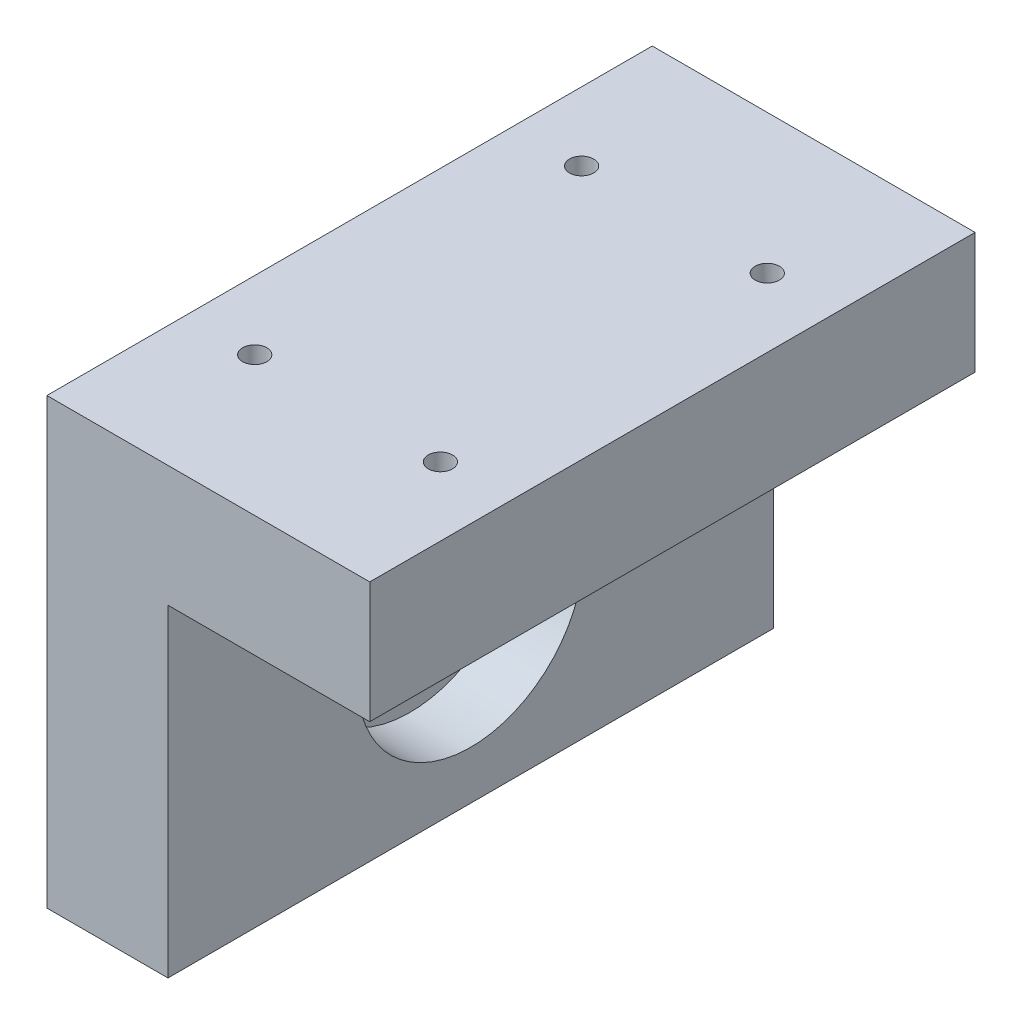
ISO-10303-21;
HEADER;
FILE_DESCRIPTION(('STEP AP214'),'2;1');
FILE_NAME('part.step','',(''),(''),'','','');
FILE_SCHEMA(('AUTOMOTIVE_DESIGN { 1 0 10303 214 1 1 1 1 }'));
ENDSEC;
DATA;
#1=APPLICATION_CONTEXT('core data for automotive mechanical design processes');
#2=APPLICATION_PROTOCOL_DEFINITION('international standard','automotive_design',2000,#1);
#3=PRODUCT_CONTEXT('',#1,'mechanical');
#4=PRODUCT('Part','Part','',(#3));
#5=PRODUCT_RELATED_PRODUCT_CATEGORY('part','',(#4));
#6=PRODUCT_DEFINITION_FORMATION('','',#4);
#7=PRODUCT_DEFINITION_CONTEXT('part definition',#1,'design');
#8=PRODUCT_DEFINITION('design','',#6,#7);
#9=PRODUCT_DEFINITION_SHAPE('','',#8);
#10=(LENGTH_UNIT() NAMED_UNIT(*) SI_UNIT(.MILLI.,.METRE.));
#11=(NAMED_UNIT(*) PLANE_ANGLE_UNIT() SI_UNIT($,.RADIAN.));
#12=(NAMED_UNIT(*) SI_UNIT($,.STERADIAN.) SOLID_ANGLE_UNIT());
#13=UNCERTAINTY_MEASURE_WITH_UNIT(LENGTH_MEASURE(1.E-05),#10,'distance_accuracy_value','');
#14=(GEOMETRIC_REPRESENTATION_CONTEXT(3) GLOBAL_UNCERTAINTY_ASSIGNED_CONTEXT((#13)) GLOBAL_UNIT_ASSIGNED_CONTEXT((#10,
#11,#12)) REPRESENTATION_CONTEXT('',''));
#15=CARTESIAN_POINT('',(0.,0.,0.));
#16=DIRECTION('',(0.,0.,1.));
#17=DIRECTION('',(1.,0.,0.));
#18=AXIS2_PLACEMENT_3D('',#15,#16,#17);
#19=CARTESIAN_POINT('',(15.,0.,0.));
#20=DIRECTION('',(0.,0.,1.));
#21=DIRECTION('',(1.,0.,0.));
#22=AXIS2_PLACEMENT_3D('',#19,#20,#21);
#23=PLANE('',#22);
#24=DIRECTION('',(0.,1.,0.));
#25=VECTOR('',#24,1.);
#26=CARTESIAN_POINT('',(0.,0.,0.));
#27=LINE('',#26,#25);
#28=CARTESIAN_POINT('',(0.,0.,0.));
#29=VERTEX_POINT('',#28);
#30=CARTESIAN_POINT('',(0.,55.,0.));
#31=VERTEX_POINT('',#30);
#32=EDGE_CURVE('E122',#29,#31,#27,.T.);
#33=ORIENTED_EDGE('',*,*,#32,.T.);
#34=DIRECTION('',(-1.,0.,0.));
#35=VECTOR('',#34,1.);
#36=CARTESIAN_POINT('',(0.,55.,0.));
#37=LINE('',#36,#35);
#38=CARTESIAN_POINT('',(40.,55.,0.));
#39=VERTEX_POINT('',#38);
#40=EDGE_CURVE('E205',#39,#31,#37,.T.);
#41=ORIENTED_EDGE('',*,*,#40,.F.);
#42=DIRECTION('',(0.,-1.,0.));
#43=VECTOR('',#42,1.);
#44=CARTESIAN_POINT('',(40.,55.,0.));
#45=LINE('',#44,#43);
#46=CARTESIAN_POINT('',(40.,40.,0.));
#47=VERTEX_POINT('',#46);
#48=EDGE_CURVE('E207',#39,#47,#45,.T.);
#49=ORIENTED_EDGE('',*,*,#48,.T.);
#50=DIRECTION('',(-1.,0.,0.));
#51=VECTOR('',#50,1.);
#52=CARTESIAN_POINT('',(0.,40.,0.));
#53=LINE('',#52,#51);
#54=CARTESIAN_POINT('',(15.,40.,0.));
#55=VERTEX_POINT('',#54);
#56=EDGE_CURVE('E197',#47,#55,#53,.T.);
#57=ORIENTED_EDGE('',*,*,#56,.T.);
#58=DIRECTION('',(0.,1.,0.));
#59=VECTOR('',#58,1.);
#60=CARTESIAN_POINT('',(15.,0.,0.));
#61=LINE('',#60,#59);
#62=CARTESIAN_POINT('',(15.,0.,0.));
#63=VERTEX_POINT('',#62);
#64=EDGE_CURVE('E111',#63,#55,#61,.T.);
#65=ORIENTED_EDGE('',*,*,#64,.F.);
#66=DIRECTION('',(-1.,0.,0.));
#67=VECTOR('',#66,1.);
#68=CARTESIAN_POINT('',(15.,0.,0.));
#69=LINE('',#68,#67);
#70=EDGE_CURVE('E65',#63,#29,#69,.T.);
#71=ORIENTED_EDGE('',*,*,#70,.T.);
#72=EDGE_LOOP('',(#33,#41,#49,#57,#65,#71));
#73=FACE_BOUND('',#72,.T.);
#74=ADVANCED_FACE('F47',(#73),#23,.F.);
#75=CARTESIAN_POINT('',(15.,0.,75.));
#76=DIRECTION('',(0.,0.,1.));
#77=DIRECTION('',(1.,0.,0.));
#78=AXIS2_PLACEMENT_3D('',#75,#76,#77);
#79=PLANE('',#78);
#80=DIRECTION('',(0.,1.,0.));
#81=VECTOR('',#80,1.);
#82=CARTESIAN_POINT('',(0.,0.,75.));
#83=LINE('',#82,#81);
#84=CARTESIAN_POINT('',(0.,0.,75.));
#85=VERTEX_POINT('',#84);
#86=CARTESIAN_POINT('',(0.,55.,75.));
#87=VERTEX_POINT('',#86);
#88=EDGE_CURVE('E125',#85,#87,#83,.T.);
#89=ORIENTED_EDGE('',*,*,#88,.F.);
#90=DIRECTION('',(-1.,0.,0.));
#91=VECTOR('',#90,1.);
#92=CARTESIAN_POINT('',(15.,0.,75.));
#93=LINE('',#92,#91);
#94=CARTESIAN_POINT('',(15.,0.,75.));
#95=VERTEX_POINT('',#94);
#96=EDGE_CURVE('E57',#95,#85,#93,.T.);
#97=ORIENTED_EDGE('',*,*,#96,.F.);
#98=DIRECTION('',(0.,1.,0.));
#99=VECTOR('',#98,1.);
#100=CARTESIAN_POINT('',(15.,0.,75.));
#101=LINE('',#100,#99);
#102=CARTESIAN_POINT('',(15.,40.,75.));
#103=VERTEX_POINT('',#102);
#104=EDGE_CURVE('E110',#95,#103,#101,.T.);
#105=ORIENTED_EDGE('',*,*,#104,.T.);
#106=DIRECTION('',(1.,0.,0.));
#107=VECTOR('',#106,1.);
#108=CARTESIAN_POINT('',(0.,40.,75.));
#109=LINE('',#108,#107);
#110=CARTESIAN_POINT('',(40.,40.,75.));
#111=VERTEX_POINT('',#110);
#112=EDGE_CURVE('E92',#103,#111,#109,.T.);
#113=ORIENTED_EDGE('',*,*,#112,.T.);
#114=DIRECTION('',(0.,-1.,0.));
#115=VECTOR('',#114,1.);
#116=CARTESIAN_POINT('',(40.,55.,75.));
#117=LINE('',#116,#115);
#118=CARTESIAN_POINT('',(40.,55.,75.));
#119=VERTEX_POINT('',#118);
#120=EDGE_CURVE('E216',#119,#111,#117,.T.);
#121=ORIENTED_EDGE('',*,*,#120,.F.);
#122=DIRECTION('',(1.,0.,0.));
#123=VECTOR('',#122,1.);
#124=CARTESIAN_POINT('',(0.,55.,75.));
#125=LINE('',#124,#123);
#126=EDGE_CURVE('E196',#87,#119,#125,.T.);
#127=ORIENTED_EDGE('',*,*,#126,.F.);
#128=EDGE_LOOP('',(#89,#97,#105,#113,#121,#127));
#129=FACE_BOUND('',#128,.T.);
#130=ADVANCED_FACE('F114',(#129),#79,.T.);
#131=CARTESIAN_POINT('',(15.,20.,37.5));
#132=DIRECTION('',(-1.,0.,0.));
#133=DIRECTION('',(0.,0.,1.));
#134=AXIS2_PLACEMENT_3D('',#131,#132,#133);
#135=CYLINDRICAL_SURFACE('',#134,14.);
#136=CARTESIAN_POINT('',(7.5,20.,37.5));
#137=DIRECTION('',(1.,0.,0.));
#138=DIRECTION('',(0.,0.,-1.));
#139=AXIS2_PLACEMENT_3D('',#136,#137,#138);
#140=CIRCLE('',#139,14.);
#141=CARTESIAN_POINT('',(7.5,20.,23.5));
#142=VERTEX_POINT('',#141);
#143=EDGE_CURVE('E11',#142,#142,#140,.T.);
#144=ORIENTED_EDGE('',*,*,#143,.F.);
#145=EDGE_LOOP('',(#144));
#146=FACE_BOUND('',#145,.T.);
#147=CARTESIAN_POINT('',(15.,20.,37.5));
#148=DIRECTION('',(1.,0.,0.));
#149=DIRECTION('',(0.,0.,-1.));
#150=AXIS2_PLACEMENT_3D('',#147,#148,#149);
#151=CIRCLE('',#150,14.);
#152=CARTESIAN_POINT('',(15.,20.,23.5));
#153=VERTEX_POINT('',#152);
#154=EDGE_CURVE('E134',#153,#153,#151,.T.);
#155=ORIENTED_EDGE('',*,*,#154,.T.);
#156=EDGE_LOOP('',(#155));
#157=FACE_BOUND('',#156,.T.);
#158=ADVANCED_FACE('F49',(#146,#157),#135,.F.);
#159=CARTESIAN_POINT('',(15.,0.,0.));
#160=DIRECTION('',(0.,-1.,0.));
#161=DIRECTION('',(0.,0.,-1.));
#162=AXIS2_PLACEMENT_3D('',#159,#160,#161);
#163=PLANE('',#162);
#164=DIRECTION('',(0.,0.,1.));
#165=VECTOR('',#164,1.);
#166=CARTESIAN_POINT('',(0.,0.,0.));
#167=LINE('',#166,#165);
#168=EDGE_CURVE('E130',#29,#85,#167,.T.);
#169=ORIENTED_EDGE('',*,*,#168,.F.);
#170=ORIENTED_EDGE('',*,*,#70,.F.);
#171=DIRECTION('',(0.,0.,1.));
#172=VECTOR('',#171,1.);
#173=CARTESIAN_POINT('',(15.,0.,0.));
#174=LINE('',#173,#172);
#175=EDGE_CURVE('E116',#63,#95,#174,.T.);
#176=ORIENTED_EDGE('',*,*,#175,.T.);
#177=ORIENTED_EDGE('',*,*,#96,.T.);
#178=EDGE_LOOP('',(#169,#170,#176,#177));
#179=FACE_BOUND('',#178,.T.);
#180=ADVANCED_FACE('F147',(#179),#163,.T.);
#181=CARTESIAN_POINT('',(15.,0.,0.));
#182=DIRECTION('',(1.,0.,0.));
#183=DIRECTION('',(0.,0.,-1.));
#184=AXIS2_PLACEMENT_3D('',#181,#182,#183);
#185=PLANE('',#184);
#186=ORIENTED_EDGE('',*,*,#154,.F.);
#187=EDGE_LOOP('',(#186));
#188=FACE_BOUND('',#187,.T.);
#189=ORIENTED_EDGE('',*,*,#64,.T.);
#190=DIRECTION('',(0.,0.,1.));
#191=VECTOR('',#190,1.);
#192=CARTESIAN_POINT('',(15.,40.,0.));
#193=LINE('',#192,#191);
#194=EDGE_CURVE('E82',#55,#103,#193,.T.);
#195=ORIENTED_EDGE('',*,*,#194,.T.);
#196=ORIENTED_EDGE('',*,*,#104,.F.);
#197=ORIENTED_EDGE('',*,*,#175,.F.);
#198=EDGE_LOOP('',(#189,#195,#196,#197));
#199=FACE_BOUND('',#198,.T.);
#200=ADVANCED_FACE('F108',(#188,#199),#185,.T.);
#201=CARTESIAN_POINT('',(0.,0.,0.));
#202=DIRECTION('',(1.,0.,0.));
#203=DIRECTION('',(0.,0.,-1.));
#204=AXIS2_PLACEMENT_3D('',#201,#202,#203);
#205=PLANE('',#204);
#206=ORIENTED_EDGE('',*,*,#32,.F.);
#207=ORIENTED_EDGE('',*,*,#168,.T.);
#208=ORIENTED_EDGE('',*,*,#88,.T.);
#209=DIRECTION('',(0.,0.,1.));
#210=VECTOR('',#209,1.);
#211=CARTESIAN_POINT('',(0.,55.,0.));
#212=LINE('',#211,#210);
#213=EDGE_CURVE('E146',#31,#87,#212,.T.);
#214=ORIENTED_EDGE('',*,*,#213,.F.);
#215=EDGE_LOOP('',(#206,#207,#208,#214));
#216=FACE_BOUND('',#215,.T.);
#217=CARTESIAN_POINT('',(0.,20.,37.5));
#218=DIRECTION('',(1.,0.,0.));
#219=DIRECTION('',(0.,0.,-1.));
#220=AXIS2_PLACEMENT_3D('',#217,#218,#219);
#221=CIRCLE('',#220,3.);
#222=CARTESIAN_POINT('',(0.,20.,34.5));
#223=VERTEX_POINT('',#222);
#224=EDGE_CURVE('E219',#223,#223,#221,.T.);
#225=ORIENTED_EDGE('',*,*,#224,.T.);
#226=EDGE_LOOP('',(#225));
#227=FACE_BOUND('',#226,.T.);
#228=ADVANCED_FACE('F143',(#216,#227),#205,.F.);
#229=CARTESIAN_POINT('',(7.5,20.,37.5));
#230=DIRECTION('',(-1.,0.,0.));
#231=DIRECTION('',(0.,0.,1.));
#232=AXIS2_PLACEMENT_3D('',#229,#230,#231);
#233=CYLINDRICAL_SURFACE('',#232,3.);
#234=CARTESIAN_POINT('',(7.5,20.,37.5));
#235=DIRECTION('',(1.,0.,0.));
#236=DIRECTION('',(0.,0.,-1.));
#237=AXIS2_PLACEMENT_3D('',#234,#235,#236);
#238=CIRCLE('',#237,3.);
#239=CARTESIAN_POINT('',(7.5,20.,34.5));
#240=VERTEX_POINT('',#239);
#241=EDGE_CURVE('E126',#240,#240,#238,.T.);
#242=ORIENTED_EDGE('',*,*,#241,.T.);
#243=EDGE_LOOP('',(#242));
#244=FACE_BOUND('',#243,.T.);
#245=ORIENTED_EDGE('',*,*,#224,.F.);
#246=EDGE_LOOP('',(#245));
#247=FACE_BOUND('',#246,.T.);
#248=ADVANCED_FACE('F233',(#244,#247),#233,.F.);
#249=CARTESIAN_POINT('',(7.5,0.,0.));
#250=DIRECTION('',(1.,0.,0.));
#251=DIRECTION('',(0.,0.,-1.));
#252=AXIS2_PLACEMENT_3D('',#249,#250,#251);
#253=PLANE('',#252);
#254=ORIENTED_EDGE('',*,*,#241,.F.);
#255=EDGE_LOOP('',(#254));
#256=FACE_BOUND('',#255,.T.);
#257=ORIENTED_EDGE('',*,*,#143,.T.);
#258=EDGE_LOOP('',(#257));
#259=FACE_BOUND('',#258,.T.);
#260=ADVANCED_FACE('F235',(#256,#259),#253,.T.);
#261=CARTESIAN_POINT('',(0.,55.,0.));
#262=DIRECTION('',(0.,1.,0.));
#263=DIRECTION('',(0.,0.,1.));
#264=AXIS2_PLACEMENT_3D('',#261,#262,#263);
#265=PLANE('',#264);
#266=CARTESIAN_POINT('',(31.5,55.,57.75));
#267=DIRECTION('',(0.,1.,0.));
#268=DIRECTION('',(0.,0.,-1.));
#269=AXIS2_PLACEMENT_3D('',#266,#267,#268);
#270=CIRCLE('',#269,1.5);
#271=CARTESIAN_POINT('',(31.5,55.,56.25));
#272=VERTEX_POINT('',#271);
#273=EDGE_CURVE('E269',#272,#272,#270,.T.);
#274=ORIENTED_EDGE('',*,*,#273,.F.);
#275=EDGE_LOOP('',(#274));
#276=FACE_BOUND('',#275,.T.);
#277=CARTESIAN_POINT('',(8.5,55.,17.25));
#278=DIRECTION('',(0.,1.,0.));
#279=DIRECTION('',(0.,0.,1.));
#280=AXIS2_PLACEMENT_3D('',#277,#278,#279);
#281=CIRCLE('',#280,1.5);
#282=CARTESIAN_POINT('',(8.5,55.,18.75));
#283=VERTEX_POINT('',#282);
#284=EDGE_CURVE('E103',#283,#283,#281,.T.);
#285=ORIENTED_EDGE('',*,*,#284,.F.);
#286=EDGE_LOOP('',(#285));
#287=FACE_BOUND('',#286,.T.);
#288=ORIENTED_EDGE('',*,*,#213,.T.);
#289=ORIENTED_EDGE('',*,*,#126,.T.);
#290=DIRECTION('',(0.,0.,-1.));
#291=VECTOR('',#290,1.);
#292=CARTESIAN_POINT('',(40.,55.,0.));
#293=LINE('',#292,#291);
#294=EDGE_CURVE('E201',#119,#39,#293,.T.);
#295=ORIENTED_EDGE('',*,*,#294,.T.);
#296=ORIENTED_EDGE('',*,*,#40,.T.);
#297=EDGE_LOOP('',(#288,#289,#295,#296));
#298=FACE_BOUND('',#297,.T.);
#299=CARTESIAN_POINT('',(31.5,55.,17.25));
#300=DIRECTION('',(0.,1.,0.));
#301=DIRECTION('',(0.,0.,1.));
#302=AXIS2_PLACEMENT_3D('',#299,#300,#301);
#303=CIRCLE('',#302,1.5);
#304=CARTESIAN_POINT('',(31.5,55.,18.75));
#305=VERTEX_POINT('',#304);
#306=EDGE_CURVE('E183',#305,#305,#303,.T.);
#307=ORIENTED_EDGE('',*,*,#306,.F.);
#308=EDGE_LOOP('',(#307));
#309=FACE_BOUND('',#308,.T.);
#310=CARTESIAN_POINT('',(8.49999999999999,55.,57.75));
#311=DIRECTION('',(0.,1.,0.));
#312=DIRECTION('',(0.,0.,-1.));
#313=AXIS2_PLACEMENT_3D('',#310,#311,#312);
#314=CIRCLE('',#313,1.5);
#315=CARTESIAN_POINT('',(8.49999999999999,55.,56.25));
#316=VERTEX_POINT('',#315);
#317=EDGE_CURVE('E275',#316,#316,#314,.T.);
#318=ORIENTED_EDGE('',*,*,#317,.F.);
#319=EDGE_LOOP('',(#318));
#320=FACE_BOUND('',#319,.T.);
#321=ADVANCED_FACE('F240',(#276,#287,#298,#309,#320),#265,.T.);
#322=CARTESIAN_POINT('',(0.,40.,0.));
#323=DIRECTION('',(0.,1.,0.));
#324=DIRECTION('',(0.,0.,1.));
#325=AXIS2_PLACEMENT_3D('',#322,#323,#324);
#326=PLANE('',#325);
#327=ORIENTED_EDGE('',*,*,#194,.F.);
#328=ORIENTED_EDGE('',*,*,#56,.F.);
#329=DIRECTION('',(0.,0.,-1.));
#330=VECTOR('',#329,1.);
#331=CARTESIAN_POINT('',(40.,40.,0.));
#332=LINE('',#331,#330);
#333=EDGE_CURVE('E97',#111,#47,#332,.T.);
#334=ORIENTED_EDGE('',*,*,#333,.F.);
#335=ORIENTED_EDGE('',*,*,#112,.F.);
#336=EDGE_LOOP('',(#327,#328,#334,#335));
#337=FACE_BOUND('',#336,.T.);
#338=CARTESIAN_POINT('',(31.5,40.,17.25));
#339=DIRECTION('',(0.,1.,0.));
#340=DIRECTION('',(0.,0.,1.));
#341=AXIS2_PLACEMENT_3D('',#338,#339,#340);
#342=CIRCLE('',#341,1.5);
#343=CARTESIAN_POINT('',(31.5,40.,18.75));
#344=VERTEX_POINT('',#343);
#345=EDGE_CURVE('E190',#344,#344,#342,.T.);
#346=ORIENTED_EDGE('',*,*,#345,.T.);
#347=EDGE_LOOP('',(#346));
#348=FACE_BOUND('',#347,.T.);
#349=CARTESIAN_POINT('',(31.5,40.,57.75));
#350=DIRECTION('',(0.,1.,0.));
#351=DIRECTION('',(0.,0.,-1.));
#352=AXIS2_PLACEMENT_3D('',#349,#350,#351);
#353=CIRCLE('',#352,1.5);
#354=CARTESIAN_POINT('',(31.5,40.,56.25));
#355=VERTEX_POINT('',#354);
#356=EDGE_CURVE('E272',#355,#355,#353,.T.);
#357=ORIENTED_EDGE('',*,*,#356,.T.);
#358=EDGE_LOOP('',(#357));
#359=FACE_BOUND('',#358,.T.);
#360=ADVANCED_FACE('F93',(#337,#348,#359),#326,.F.);
#361=CARTESIAN_POINT('',(40.,55.,0.));
#362=DIRECTION('',(-1.,0.,0.));
#363=DIRECTION('',(0.,0.,1.));
#364=AXIS2_PLACEMENT_3D('',#361,#362,#363);
#365=PLANE('',#364);
#366=ORIENTED_EDGE('',*,*,#333,.T.);
#367=ORIENTED_EDGE('',*,*,#48,.F.);
#368=ORIENTED_EDGE('',*,*,#294,.F.);
#369=ORIENTED_EDGE('',*,*,#120,.T.);
#370=EDGE_LOOP('',(#366,#367,#368,#369));
#371=FACE_BOUND('',#370,.T.);
#372=ADVANCED_FACE('F245',(#371),#365,.F.);
#373=CARTESIAN_POINT('',(8.5,55.,17.25));
#374=DIRECTION('',(0.,-1.,0.));
#375=DIRECTION('',(0.,0.,-1.));
#376=AXIS2_PLACEMENT_3D('',#373,#374,#375);
#377=CYLINDRICAL_SURFACE('',#376,1.5);
#378=ORIENTED_EDGE('',*,*,#284,.T.);
#379=EDGE_LOOP('',(#378));
#380=FACE_BOUND('',#379,.T.);
#381=CARTESIAN_POINT('',(8.5,40.,17.25));
#382=DIRECTION('',(0.,1.,0.));
#383=DIRECTION('',(0.,0.,1.));
#384=AXIS2_PLACEMENT_3D('',#381,#382,#383);
#385=CIRCLE('',#384,1.5);
#386=CARTESIAN_POINT('',(8.5,40.,18.75));
#387=VERTEX_POINT('',#386);
#388=EDGE_CURVE('E180',#387,#387,#385,.T.);
#389=ORIENTED_EDGE('',*,*,#388,.F.);
#390=EDGE_LOOP('',(#389));
#391=FACE_BOUND('',#390,.T.);
#392=ADVANCED_FACE('F248',(#380,#391),#377,.F.);
#393=CARTESIAN_POINT('',(31.5,55.,17.25));
#394=DIRECTION('',(0.,-1.,0.));
#395=DIRECTION('',(0.,0.,-1.));
#396=AXIS2_PLACEMENT_3D('',#393,#394,#395);
#397=CYLINDRICAL_SURFACE('',#396,1.5);
#398=ORIENTED_EDGE('',*,*,#306,.T.);
#399=EDGE_LOOP('',(#398));
#400=FACE_BOUND('',#399,.T.);
#401=ORIENTED_EDGE('',*,*,#345,.F.);
#402=EDGE_LOOP('',(#401));
#403=FACE_BOUND('',#402,.T.);
#404=ADVANCED_FACE('F257',(#400,#403),#397,.F.);
#405=CARTESIAN_POINT('',(31.5,55.,57.75));
#406=DIRECTION('',(0.,-1.,0.));
#407=DIRECTION('',(0.,0.,-1.));
#408=AXIS2_PLACEMENT_3D('',#405,#406,#407);
#409=CYLINDRICAL_SURFACE('',#408,1.5);
#410=ORIENTED_EDGE('',*,*,#273,.T.);
#411=EDGE_LOOP('',(#410));
#412=FACE_BOUND('',#411,.T.);
#413=ORIENTED_EDGE('',*,*,#356,.F.);
#414=EDGE_LOOP('',(#413));
#415=FACE_BOUND('',#414,.T.);
#416=ADVANCED_FACE('F175',(#412,#415),#409,.F.);
#417=CARTESIAN_POINT('',(8.49999999999999,55.,57.75));
#418=DIRECTION('',(0.,-1.,0.));
#419=DIRECTION('',(0.,0.,-1.));
#420=AXIS2_PLACEMENT_3D('',#417,#418,#419);
#421=CYLINDRICAL_SURFACE('',#420,1.5);
#422=ORIENTED_EDGE('',*,*,#317,.T.);
#423=EDGE_LOOP('',(#422));
#424=FACE_BOUND('',#423,.T.);
#425=CARTESIAN_POINT('',(8.49999999999999,40.,57.75));
#426=DIRECTION('',(0.,1.,0.));
#427=DIRECTION('',(0.,0.,-1.));
#428=AXIS2_PLACEMENT_3D('',#425,#426,#427);
#429=CIRCLE('',#428,1.5);
#430=CARTESIAN_POINT('',(8.49999999999999,40.,56.25));
#431=VERTEX_POINT('',#430);
#432=EDGE_CURVE('E281',#431,#431,#429,.T.);
#433=ORIENTED_EDGE('',*,*,#432,.F.);
#434=EDGE_LOOP('',(#433));
#435=FACE_BOUND('',#434,.T.);
#436=ADVANCED_FACE('F168',(#424,#435),#421,.F.);
#437=CARTESIAN_POINT('',(15.,40.,0.));
#438=DIRECTION('',(0.,-1.,0.));
#439=DIRECTION('',(0.,0.,-1.));
#440=AXIS2_PLACEMENT_3D('',#437,#438,#439);
#441=PLANE('',#440);
#442=ORIENTED_EDGE('',*,*,#388,.T.);
#443=EDGE_LOOP('',(#442));
#444=FACE_BOUND('',#443,.T.);
#445=ADVANCED_FACE('F165',(#444),#441,.F.);
#446=ORIENTED_EDGE('',*,*,#432,.T.);
#447=EDGE_LOOP('',(#446));
#448=FACE_BOUND('',#447,.T.);
#449=ADVANCED_FACE('F167',(#448),#441,.F.);
#450=CLOSED_SHELL('',(#74,#130,#158,#180,#200,#228,#248,#260,#321,#360,#372,#392,#404,#416,#436,
#445,#449));
#451=MANIFOLD_SOLID_BREP('B2',#450);
#452=ADVANCED_BREP_SHAPE_REPRESENTATION('',(#18,#451),#14);
#453=SHAPE_DEFINITION_REPRESENTATION(#9,#452);
ENDSEC;
END-ISO-10303-21;
